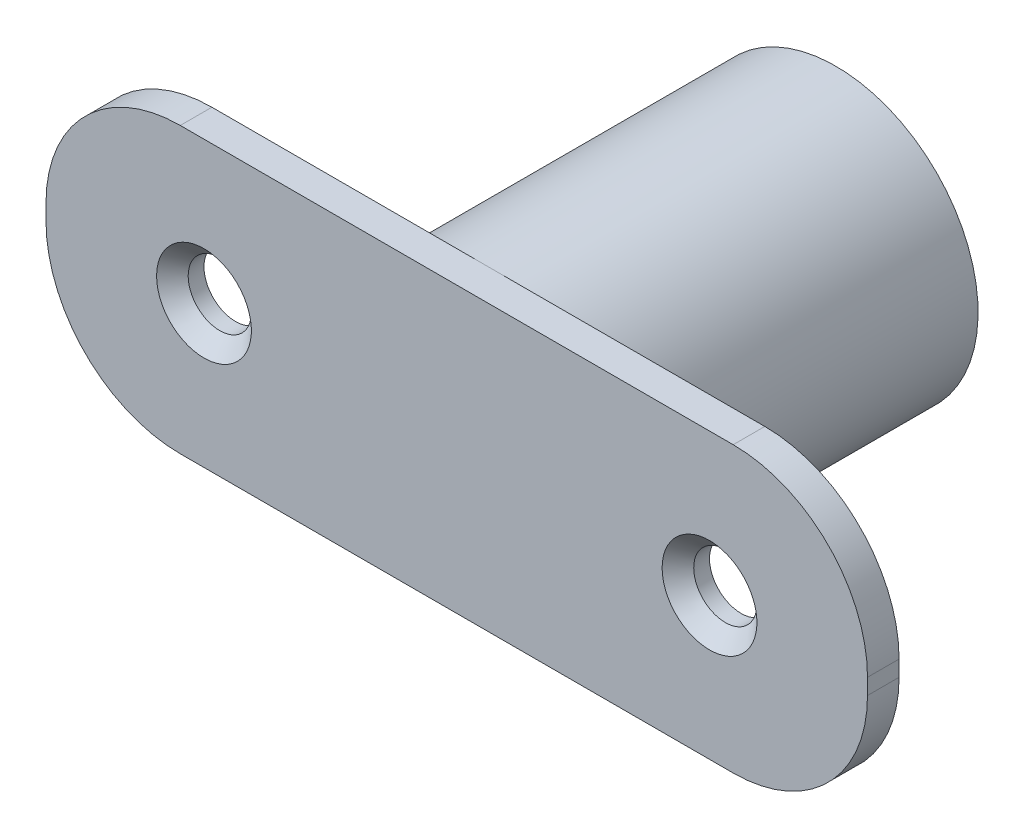
ISO-10303-21;
HEADER;
FILE_DESCRIPTION(('STEP AP214'),'2;1');
FILE_NAME('part.step','',(''),(''),'','','');
FILE_SCHEMA(('AUTOMOTIVE_DESIGN { 1 0 10303 214 1 1 1 1 }'));
ENDSEC;
DATA;
#1=APPLICATION_CONTEXT('core data for automotive mechanical design processes');
#2=APPLICATION_PROTOCOL_DEFINITION('international standard','automotive_design',2000,#1);
#3=PRODUCT_CONTEXT('',#1,'mechanical');
#4=PRODUCT('Part','Part','',(#3));
#5=PRODUCT_RELATED_PRODUCT_CATEGORY('part','',(#4));
#6=PRODUCT_DEFINITION_FORMATION('','',#4);
#7=PRODUCT_DEFINITION_CONTEXT('part definition',#1,'design');
#8=PRODUCT_DEFINITION('design','',#6,#7);
#9=PRODUCT_DEFINITION_SHAPE('','',#8);
#10=(LENGTH_UNIT() NAMED_UNIT(*) SI_UNIT(.MILLI.,.METRE.));
#11=(NAMED_UNIT(*) PLANE_ANGLE_UNIT() SI_UNIT($,.RADIAN.));
#12=(NAMED_UNIT(*) SI_UNIT($,.STERADIAN.) SOLID_ANGLE_UNIT());
#13=UNCERTAINTY_MEASURE_WITH_UNIT(LENGTH_MEASURE(1.E-05),#10,'distance_accuracy_value','');
#14=(GEOMETRIC_REPRESENTATION_CONTEXT(3) GLOBAL_UNCERTAINTY_ASSIGNED_CONTEXT((#13)) GLOBAL_UNIT_ASSIGNED_CONTEXT((#10,
#11,#12)) REPRESENTATION_CONTEXT('',''));
#15=CARTESIAN_POINT('',(0.,0.,0.));
#16=DIRECTION('',(0.,0.,1.));
#17=DIRECTION('',(1.,0.,0.));
#18=AXIS2_PLACEMENT_3D('',#15,#16,#17);
#19=CARTESIAN_POINT('',(43.5,-9.5,0.));
#20=DIRECTION('',(0.,0.,-1.));
#21=DIRECTION('',(-1.,0.,0.));
#22=AXIS2_PLACEMENT_3D('',#19,#20,#21);
#23=PLANE('',#22);
#24=CARTESIAN_POINT('',(26.,-9.,0.));
#25=DIRECTION('',(0.,0.,-1.));
#26=DIRECTION('',(-1.,0.,0.));
#27=AXIS2_PLACEMENT_3D('',#24,#25,#26);
#28=CIRCLE('',#27,9.);
#29=CARTESIAN_POINT('',(26.,0.,0.));
#30=VERTEX_POINT('',#29);
#31=CARTESIAN_POINT('',(26.,-18.,0.));
#32=VERTEX_POINT('',#31);
#33=EDGE_CURVE('E208',#30,#32,#28,.T.);
#34=ORIENTED_EDGE('',*,*,#33,.F.);
#35=DIRECTION('',(-1.,0.,0.));
#36=VECTOR('',#35,1.);
#37=CARTESIAN_POINT('',(8.50000000000006,0.,0.));
#38=LINE('',#37,#36);
#39=CARTESIAN_POINT('',(43.4999999999999,0.,0.));
#40=VERTEX_POINT('',#39);
#41=EDGE_CURVE('E152',#40,#30,#38,.T.);
#42=ORIENTED_EDGE('',*,*,#41,.F.);
#43=CARTESIAN_POINT('',(43.5,-8.5,0.));
#44=DIRECTION('',(0.,0.,1.));
#45=DIRECTION('',(-1.,0.,0.));
#46=AXIS2_PLACEMENT_3D('',#43,#44,#45);
#47=CIRCLE('',#46,8.5);
#48=CARTESIAN_POINT('',(52.,-8.50000000000006,0.));
#49=VERTEX_POINT('',#48);
#50=EDGE_CURVE('E149',#49,#40,#47,.T.);
#51=ORIENTED_EDGE('',*,*,#50,.F.);
#52=DIRECTION('',(0.,1.,0.));
#53=VECTOR('',#52,1.);
#54=CARTESIAN_POINT('',(52.,-8.50000000000006,0.));
#55=LINE('',#54,#53);
#56=CARTESIAN_POINT('',(52.,-9.49999999999994,0.));
#57=VERTEX_POINT('',#56);
#58=EDGE_CURVE('E146',#57,#49,#55,.T.);
#59=ORIENTED_EDGE('',*,*,#58,.F.);
#60=CARTESIAN_POINT('',(43.5,-9.5,0.));
#61=DIRECTION('',(0.,0.,1.));
#62=DIRECTION('',(-1.,0.,0.));
#63=AXIS2_PLACEMENT_3D('',#60,#61,#62);
#64=CIRCLE('',#63,8.5);
#65=CARTESIAN_POINT('',(43.4999999999999,-18.,0.));
#66=VERTEX_POINT('',#65);
#67=EDGE_CURVE('E143',#66,#57,#64,.T.);
#68=ORIENTED_EDGE('',*,*,#67,.F.);
#69=DIRECTION('',(1.,0.,0.));
#70=VECTOR('',#69,1.);
#71=CARTESIAN_POINT('',(8.50000000000006,-18.,0.));
#72=LINE('',#71,#70);
#73=EDGE_CURVE('E91',#32,#66,#72,.T.);
#74=ORIENTED_EDGE('',*,*,#73,.F.);
#75=EDGE_LOOP('',(#34,#42,#51,#59,#68,#74));
#76=FACE_BOUND('',#75,.T.);
#77=CARTESIAN_POINT('',(42.,-8.99999999999999,0.));
#78=DIRECTION('',(0.,0.,1.));
#79=DIRECTION('',(1.,0.,0.));
#80=AXIS2_PLACEMENT_3D('',#77,#78,#79);
#81=CIRCLE('',#80,2.);
#82=CARTESIAN_POINT('',(44.,-8.99999999999999,0.));
#83=VERTEX_POINT('',#82);
#84=EDGE_CURVE('E201',#83,#83,#81,.T.);
#85=ORIENTED_EDGE('',*,*,#84,.T.);
#86=EDGE_LOOP('',(#85));
#87=FACE_BOUND('',#86,.T.);
#88=ADVANCED_FACE('F35',(#76,#87),#23,.T.);
#89=CARTESIAN_POINT('',(43.5,-9.5,2.));
#90=DIRECTION('',(0.,0.,-1.));
#91=DIRECTION('',(-1.,0.,0.));
#92=AXIS2_PLACEMENT_3D('',#89,#90,#91);
#93=PLANE('',#92);
#94=CARTESIAN_POINT('',(42.,-8.99999999999999,2.));
#95=DIRECTION('',(0.,0.,-1.));
#96=DIRECTION('',(-1.,0.,0.));
#97=AXIS2_PLACEMENT_3D('',#94,#95,#96);
#98=CIRCLE('',#97,3.00000000000002);
#99=CARTESIAN_POINT('',(39.,-8.99999999999999,2.));
#100=VERTEX_POINT('',#99);
#101=EDGE_CURVE('E43',#100,#100,#98,.T.);
#102=ORIENTED_EDGE('',*,*,#101,.T.);
#103=EDGE_LOOP('',(#102));
#104=FACE_BOUND('',#103,.T.);
#105=CARTESIAN_POINT('',(10.,-9.,2.));
#106=DIRECTION('',(0.,0.,-1.));
#107=DIRECTION('',(-1.,0.,0.));
#108=AXIS2_PLACEMENT_3D('',#105,#106,#107);
#109=CIRCLE('',#108,3.00000000000002);
#110=CARTESIAN_POINT('',(6.99999999999999,-9.,2.));
#111=VERTEX_POINT('',#110);
#112=EDGE_CURVE('E180',#111,#111,#109,.T.);
#113=ORIENTED_EDGE('',*,*,#112,.T.);
#114=EDGE_LOOP('',(#113));
#115=FACE_BOUND('',#114,.T.);
#116=CARTESIAN_POINT('',(43.5,-9.5,2.));
#117=DIRECTION('',(0.,0.,1.));
#118=DIRECTION('',(-1.,0.,0.));
#119=AXIS2_PLACEMENT_3D('',#116,#117,#118);
#120=CIRCLE('',#119,8.5);
#121=CARTESIAN_POINT('',(43.4999999999999,-18.,2.));
#122=VERTEX_POINT('',#121);
#123=CARTESIAN_POINT('',(52.,-9.49999999999994,2.));
#124=VERTEX_POINT('',#123);
#125=EDGE_CURVE('E162',#122,#124,#120,.T.);
#126=ORIENTED_EDGE('',*,*,#125,.T.);
#127=DIRECTION('',(0.,1.,0.));
#128=VECTOR('',#127,1.);
#129=CARTESIAN_POINT('',(52.,-8.50000000000006,2.));
#130=LINE('',#129,#128);
#131=CARTESIAN_POINT('',(52.,-8.50000000000006,2.));
#132=VERTEX_POINT('',#131);
#133=EDGE_CURVE('E100',#124,#132,#130,.T.);
#134=ORIENTED_EDGE('',*,*,#133,.T.);
#135=CARTESIAN_POINT('',(43.5,-8.5,2.));
#136=DIRECTION('',(0.,0.,1.));
#137=DIRECTION('',(-1.,0.,0.));
#138=AXIS2_PLACEMENT_3D('',#135,#136,#137);
#139=CIRCLE('',#138,8.5);
#140=CARTESIAN_POINT('',(43.4999999999999,0.,2.));
#141=VERTEX_POINT('',#140);
#142=EDGE_CURVE('E214',#132,#141,#139,.T.);
#143=ORIENTED_EDGE('',*,*,#142,.T.);
#144=DIRECTION('',(-1.,0.,0.));
#145=VECTOR('',#144,1.);
#146=CARTESIAN_POINT('',(8.50000000000006,0.,2.));
#147=LINE('',#146,#145);
#148=CARTESIAN_POINT('',(8.50000000000006,0.,2.));
#149=VERTEX_POINT('',#148);
#150=EDGE_CURVE('E216',#141,#149,#147,.T.);
#151=ORIENTED_EDGE('',*,*,#150,.T.);
#152=CARTESIAN_POINT('',(8.5,-8.5,2.));
#153=DIRECTION('',(0.,0.,1.));
#154=DIRECTION('',(-1.,0.,0.));
#155=AXIS2_PLACEMENT_3D('',#152,#153,#154);
#156=CIRCLE('',#155,8.5);
#157=CARTESIAN_POINT('',(0.,-8.50000000000006,2.));
#158=VERTEX_POINT('',#157);
#159=EDGE_CURVE('E121',#149,#158,#156,.T.);
#160=ORIENTED_EDGE('',*,*,#159,.T.);
#161=DIRECTION('',(0.,-1.,0.));
#162=VECTOR('',#161,1.);
#163=CARTESIAN_POINT('',(0.,-8.50000000000006,2.));
#164=LINE('',#163,#162);
#165=CARTESIAN_POINT('',(0.,-9.49999999999994,2.));
#166=VERTEX_POINT('',#165);
#167=EDGE_CURVE('E114',#158,#166,#164,.T.);
#168=ORIENTED_EDGE('',*,*,#167,.T.);
#169=CARTESIAN_POINT('',(8.5,-9.5,2.));
#170=DIRECTION('',(0.,0.,1.));
#171=DIRECTION('',(1.,0.,0.));
#172=AXIS2_PLACEMENT_3D('',#169,#170,#171);
#173=CIRCLE('',#172,8.5);
#174=CARTESIAN_POINT('',(8.50000000000006,-18.,2.));
#175=VERTEX_POINT('',#174);
#176=EDGE_CURVE('E118',#166,#175,#173,.T.);
#177=ORIENTED_EDGE('',*,*,#176,.T.);
#178=DIRECTION('',(1.,0.,0.));
#179=VECTOR('',#178,1.);
#180=CARTESIAN_POINT('',(8.50000000000006,-18.,2.));
#181=LINE('',#180,#179);
#182=EDGE_CURVE('E59',#175,#122,#181,.T.);
#183=ORIENTED_EDGE('',*,*,#182,.T.);
#184=EDGE_LOOP('',(#126,#134,#143,#151,#160,#168,#177,#183));
#185=FACE_BOUND('',#184,.T.);
#186=ADVANCED_FACE('F116',(#104,#115,#185),#93,.F.);
#187=EDGE_CURVE('E50',#32,#30,#28,.T.);
#188=ORIENTED_EDGE('',*,*,#187,.F.);
#189=CARTESIAN_POINT('',(8.50000000000006,-18.,0.));
#190=VERTEX_POINT('',#189);
#191=EDGE_CURVE('E160',#190,#32,#72,.T.);
#192=ORIENTED_EDGE('',*,*,#191,.F.);
#193=CARTESIAN_POINT('',(8.5,-9.5,0.));
#194=DIRECTION('',(0.,0.,1.));
#195=DIRECTION('',(1.,0.,0.));
#196=AXIS2_PLACEMENT_3D('',#193,#194,#195);
#197=CIRCLE('',#196,8.5);
#198=CARTESIAN_POINT('',(0.,-9.49999999999994,0.));
#199=VERTEX_POINT('',#198);
#200=EDGE_CURVE('E158',#199,#190,#197,.T.);
#201=ORIENTED_EDGE('',*,*,#200,.F.);
#202=DIRECTION('',(0.,-1.,0.));
#203=VECTOR('',#202,1.);
#204=CARTESIAN_POINT('',(0.,-8.50000000000006,0.));
#205=LINE('',#204,#203);
#206=CARTESIAN_POINT('',(0.,-8.50000000000006,0.));
#207=VERTEX_POINT('',#206);
#208=EDGE_CURVE('E130',#207,#199,#205,.T.);
#209=ORIENTED_EDGE('',*,*,#208,.F.);
#210=CARTESIAN_POINT('',(8.5,-8.5,0.));
#211=DIRECTION('',(0.,0.,1.));
#212=DIRECTION('',(-1.,0.,0.));
#213=AXIS2_PLACEMENT_3D('',#210,#211,#212);
#214=CIRCLE('',#213,8.5);
#215=CARTESIAN_POINT('',(8.50000000000006,0.,0.));
#216=VERTEX_POINT('',#215);
#217=EDGE_CURVE('E155',#216,#207,#214,.T.);
#218=ORIENTED_EDGE('',*,*,#217,.F.);
#219=EDGE_CURVE('E151',#30,#216,#38,.T.);
#220=ORIENTED_EDGE('',*,*,#219,.F.);
#221=EDGE_LOOP('',(#188,#192,#201,#209,#218,#220));
#222=FACE_BOUND('',#221,.T.);
#223=CARTESIAN_POINT('',(10.,-9.,0.));
#224=DIRECTION('',(0.,0.,1.));
#225=DIRECTION('',(1.,0.,0.));
#226=AXIS2_PLACEMENT_3D('',#223,#224,#225);
#227=CIRCLE('',#226,2.);
#228=CARTESIAN_POINT('',(12.,-9.,0.));
#229=VERTEX_POINT('',#228);
#230=EDGE_CURVE('E147',#229,#229,#227,.T.);
#231=ORIENTED_EDGE('',*,*,#230,.T.);
#232=EDGE_LOOP('',(#231));
#233=FACE_BOUND('',#232,.T.);
#234=ADVANCED_FACE('F226',(#222,#233),#23,.T.);
#235=CARTESIAN_POINT('',(43.5,-9.5,2.));
#236=DIRECTION('',(0.,0.,-1.));
#237=DIRECTION('',(-1.,0.,0.));
#238=AXIS2_PLACEMENT_3D('',#235,#236,#237);
#239=CYLINDRICAL_SURFACE('',#238,8.5);
#240=ORIENTED_EDGE('',*,*,#67,.T.);
#241=DIRECTION('',(0.,0.,-1.));
#242=VECTOR('',#241,1.);
#243=CARTESIAN_POINT('',(52.,-9.49999999999994,2.));
#244=LINE('',#243,#242);
#245=EDGE_CURVE('E175',#124,#57,#244,.T.);
#246=ORIENTED_EDGE('',*,*,#245,.F.);
#247=ORIENTED_EDGE('',*,*,#125,.F.);
#248=DIRECTION('',(0.,0.,-1.));
#249=VECTOR('',#248,1.);
#250=CARTESIAN_POINT('',(43.4999999999999,-18.,2.));
#251=LINE('',#250,#249);
#252=EDGE_CURVE('E139',#122,#66,#251,.T.);
#253=ORIENTED_EDGE('',*,*,#252,.T.);
#254=EDGE_LOOP('',(#240,#246,#247,#253));
#255=FACE_BOUND('',#254,.T.);
#256=ADVANCED_FACE('F234',(#255),#239,.T.);
#257=CARTESIAN_POINT('',(52.,-8.50000000000006,2.));
#258=DIRECTION('',(-1.,0.,0.));
#259=DIRECTION('',(0.,0.,1.));
#260=AXIS2_PLACEMENT_3D('',#257,#258,#259);
#261=PLANE('',#260);
#262=ORIENTED_EDGE('',*,*,#58,.T.);
#263=DIRECTION('',(0.,0.,-1.));
#264=VECTOR('',#263,1.);
#265=CARTESIAN_POINT('',(52.,-8.50000000000006,2.));
#266=LINE('',#265,#264);
#267=EDGE_CURVE('E172',#132,#49,#266,.T.);
#268=ORIENTED_EDGE('',*,*,#267,.F.);
#269=ORIENTED_EDGE('',*,*,#133,.F.);
#270=ORIENTED_EDGE('',*,*,#245,.T.);
#271=EDGE_LOOP('',(#262,#268,#269,#270));
#272=FACE_BOUND('',#271,.T.);
#273=ADVANCED_FACE('F235',(#272),#261,.F.);
#274=CARTESIAN_POINT('',(43.5,-8.5,2.));
#275=DIRECTION('',(0.,0.,-1.));
#276=DIRECTION('',(-1.,0.,0.));
#277=AXIS2_PLACEMENT_3D('',#274,#275,#276);
#278=CYLINDRICAL_SURFACE('',#277,8.5);
#279=ORIENTED_EDGE('',*,*,#50,.T.);
#280=DIRECTION('',(0.,0.,-1.));
#281=VECTOR('',#280,1.);
#282=CARTESIAN_POINT('',(43.4999999999999,0.,2.));
#283=LINE('',#282,#281);
#284=EDGE_CURVE('E169',#141,#40,#283,.T.);
#285=ORIENTED_EDGE('',*,*,#284,.F.);
#286=ORIENTED_EDGE('',*,*,#142,.F.);
#287=ORIENTED_EDGE('',*,*,#267,.T.);
#288=EDGE_LOOP('',(#279,#285,#286,#287));
#289=FACE_BOUND('',#288,.T.);
#290=ADVANCED_FACE('F238',(#289),#278,.T.);
#291=CARTESIAN_POINT('',(8.50000000000006,0.,2.));
#292=DIRECTION('',(0.,-1.,0.));
#293=DIRECTION('',(1.,0.,0.));
#294=AXIS2_PLACEMENT_3D('',#291,#292,#293);
#295=PLANE('',#294);
#296=ORIENTED_EDGE('',*,*,#41,.T.);
#297=ORIENTED_EDGE('',*,*,#219,.T.);
#298=DIRECTION('',(0.,0.,-1.));
#299=VECTOR('',#298,1.);
#300=CARTESIAN_POINT('',(8.50000000000006,0.,2.));
#301=LINE('',#300,#299);
#302=EDGE_CURVE('E166',#149,#216,#301,.T.);
#303=ORIENTED_EDGE('',*,*,#302,.F.);
#304=ORIENTED_EDGE('',*,*,#150,.F.);
#305=ORIENTED_EDGE('',*,*,#284,.T.);
#306=EDGE_LOOP('',(#296,#297,#303,#304,#305));
#307=FACE_BOUND('',#306,.T.);
#308=ADVANCED_FACE('F222',(#307),#295,.F.);
#309=CARTESIAN_POINT('',(8.5,-8.5,2.));
#310=DIRECTION('',(0.,0.,-1.));
#311=DIRECTION('',(-1.,0.,0.));
#312=AXIS2_PLACEMENT_3D('',#309,#310,#311);
#313=CYLINDRICAL_SURFACE('',#312,8.5);
#314=ORIENTED_EDGE('',*,*,#217,.T.);
#315=DIRECTION('',(0.,0.,-1.));
#316=VECTOR('',#315,1.);
#317=CARTESIAN_POINT('',(0.,-8.50000000000006,2.));
#318=LINE('',#317,#316);
#319=EDGE_CURVE('E133',#158,#207,#318,.T.);
#320=ORIENTED_EDGE('',*,*,#319,.F.);
#321=ORIENTED_EDGE('',*,*,#159,.F.);
#322=ORIENTED_EDGE('',*,*,#302,.T.);
#323=EDGE_LOOP('',(#314,#320,#321,#322));
#324=FACE_BOUND('',#323,.T.);
#325=ADVANCED_FACE('F225',(#324),#313,.T.);
#326=CARTESIAN_POINT('',(0.,-8.50000000000006,2.));
#327=DIRECTION('',(1.,0.,0.));
#328=DIRECTION('',(0.,1.,0.));
#329=AXIS2_PLACEMENT_3D('',#326,#327,#328);
#330=PLANE('',#329);
#331=ORIENTED_EDGE('',*,*,#208,.T.);
#332=DIRECTION('',(0.,0.,-1.));
#333=VECTOR('',#332,1.);
#334=CARTESIAN_POINT('',(0.,-9.49999999999994,2.));
#335=LINE('',#334,#333);
#336=EDGE_CURVE('E127',#166,#199,#335,.T.);
#337=ORIENTED_EDGE('',*,*,#336,.F.);
#338=ORIENTED_EDGE('',*,*,#167,.F.);
#339=ORIENTED_EDGE('',*,*,#319,.T.);
#340=EDGE_LOOP('',(#331,#337,#338,#339));
#341=FACE_BOUND('',#340,.T.);
#342=ADVANCED_FACE('F128',(#341),#330,.F.);
#343=CARTESIAN_POINT('',(8.5,-9.5,2.));
#344=DIRECTION('',(0.,0.,-1.));
#345=DIRECTION('',(-1.,0.,0.));
#346=AXIS2_PLACEMENT_3D('',#343,#344,#345);
#347=CYLINDRICAL_SURFACE('',#346,8.5);
#348=ORIENTED_EDGE('',*,*,#200,.T.);
#349=DIRECTION('',(0.,0.,-1.));
#350=VECTOR('',#349,1.);
#351=CARTESIAN_POINT('',(8.50000000000006,-18.,2.));
#352=LINE('',#351,#350);
#353=EDGE_CURVE('E134',#175,#190,#352,.T.);
#354=ORIENTED_EDGE('',*,*,#353,.F.);
#355=ORIENTED_EDGE('',*,*,#176,.F.);
#356=ORIENTED_EDGE('',*,*,#336,.T.);
#357=EDGE_LOOP('',(#348,#354,#355,#356));
#358=FACE_BOUND('',#357,.T.);
#359=ADVANCED_FACE('F136',(#358),#347,.T.);
#360=CARTESIAN_POINT('',(8.50000000000006,-18.,2.));
#361=DIRECTION('',(0.,1.,0.));
#362=DIRECTION('',(0.,0.,1.));
#363=AXIS2_PLACEMENT_3D('',#360,#361,#362);
#364=PLANE('',#363);
#365=ORIENTED_EDGE('',*,*,#191,.T.);
#366=ORIENTED_EDGE('',*,*,#73,.T.);
#367=ORIENTED_EDGE('',*,*,#252,.F.);
#368=ORIENTED_EDGE('',*,*,#182,.F.);
#369=ORIENTED_EDGE('',*,*,#353,.T.);
#370=EDGE_LOOP('',(#365,#366,#367,#368,#369));
#371=FACE_BOUND('',#370,.T.);
#372=ADVANCED_FACE('F228',(#371),#364,.F.);
#373=CARTESIAN_POINT('',(10.,-9.,2.));
#374=DIRECTION('',(0.,0.,-1.));
#375=DIRECTION('',(-1.,0.,0.));
#376=AXIS2_PLACEMENT_3D('',#373,#374,#375);
#377=CYLINDRICAL_SURFACE('',#376,2.);
#378=CARTESIAN_POINT('',(10.,-9.,0.999999999999983));
#379=DIRECTION('',(0.,0.,-1.));
#380=DIRECTION('',(-1.,0.,0.));
#381=AXIS2_PLACEMENT_3D('',#378,#379,#380);
#382=CIRCLE('',#381,2.);
#383=CARTESIAN_POINT('',(8.,-9.,0.999999999999983));
#384=VERTEX_POINT('',#383);
#385=EDGE_CURVE('E11',#384,#384,#382,.F.);
#386=ORIENTED_EDGE('',*,*,#385,.T.);
#387=EDGE_LOOP('',(#386));
#388=FACE_BOUND('',#387,.T.);
#389=ORIENTED_EDGE('',*,*,#230,.F.);
#390=EDGE_LOOP('',(#389));
#391=FACE_BOUND('',#390,.T.);
#392=ADVANCED_FACE('F197',(#388,#391),#377,.F.);
#393=CARTESIAN_POINT('',(42.,-8.99999999999999,2.));
#394=DIRECTION('',(0.,0.,-1.));
#395=DIRECTION('',(-1.,0.,0.));
#396=AXIS2_PLACEMENT_3D('',#393,#394,#395);
#397=CYLINDRICAL_SURFACE('',#396,2.);
#398=CARTESIAN_POINT('',(42.,-8.99999999999999,0.999999999999986));
#399=DIRECTION('',(0.,0.,-1.));
#400=DIRECTION('',(-1.,0.,0.));
#401=AXIS2_PLACEMENT_3D('',#398,#399,#400);
#402=CIRCLE('',#401,2.);
#403=CARTESIAN_POINT('',(40.,-8.99999999999999,0.999999999999986));
#404=VERTEX_POINT('',#403);
#405=EDGE_CURVE('E177',#404,#404,#402,.F.);
#406=ORIENTED_EDGE('',*,*,#405,.T.);
#407=EDGE_LOOP('',(#406));
#408=FACE_BOUND('',#407,.T.);
#409=ORIENTED_EDGE('',*,*,#84,.F.);
#410=EDGE_LOOP('',(#409));
#411=FACE_BOUND('',#410,.T.);
#412=ADVANCED_FACE('F193',(#408,#411),#397,.F.);
#413=CARTESIAN_POINT('',(26.,-9.,-22.));
#414=DIRECTION('',(0.,0.,1.));
#415=DIRECTION('',(1.,0.,0.));
#416=AXIS2_PLACEMENT_3D('',#413,#414,#415);
#417=CYLINDRICAL_SURFACE('',#416,9.);
#418=CARTESIAN_POINT('',(26.,-9.,-22.));
#419=DIRECTION('',(0.,0.,-1.));
#420=DIRECTION('',(-1.,0.,0.));
#421=AXIS2_PLACEMENT_3D('',#418,#419,#420);
#422=CIRCLE('',#421,9.);
#423=CARTESIAN_POINT('',(17.,-9.,-22.));
#424=VERTEX_POINT('',#423);
#425=EDGE_CURVE('E203',#424,#424,#422,.T.);
#426=ORIENTED_EDGE('',*,*,#425,.F.);
#427=EDGE_LOOP('',(#426));
#428=FACE_BOUND('',#427,.T.);
#429=ORIENTED_EDGE('',*,*,#33,.T.);
#430=ORIENTED_EDGE('',*,*,#187,.T.);
#431=EDGE_LOOP('',(#429,#430));
#432=FACE_BOUND('',#431,.T.);
#433=ADVANCED_FACE('F196',(#428,#432),#417,.T.);
#434=CARTESIAN_POINT('',(0.,0.,-22.));
#435=DIRECTION('',(0.,0.,-1.));
#436=DIRECTION('',(-1.,0.,0.));
#437=AXIS2_PLACEMENT_3D('',#434,#435,#436);
#438=PLANE('',#437);
#439=ORIENTED_EDGE('',*,*,#425,.T.);
#440=EDGE_LOOP('',(#439));
#441=FACE_BOUND('',#440,.T.);
#442=ADVANCED_FACE('F190',(#441),#438,.T.);
#443=CARTESIAN_POINT('',(42.,-8.99999999999999,0.999999999999986));
#444=DIRECTION('',(0.,0.,1.));
#445=DIRECTION('',(1.,0.,0.));
#446=AXIS2_PLACEMENT_3D('',#443,#444,#445);
#447=CONICAL_SURFACE('',#446,2.,0.785398163397448);
#448=ORIENTED_EDGE('',*,*,#101,.F.);
#449=EDGE_LOOP('',(#448));
#450=FACE_BOUND('',#449,.T.);
#451=ORIENTED_EDGE('',*,*,#405,.F.);
#452=EDGE_LOOP('',(#451));
#453=FACE_BOUND('',#452,.T.);
#454=ADVANCED_FACE('F187',(#450,#453),#447,.F.);
#455=CARTESIAN_POINT('',(10.,-9.,0.999999999999983));
#456=DIRECTION('',(0.,0.,1.));
#457=DIRECTION('',(1.,0.,0.));
#458=AXIS2_PLACEMENT_3D('',#455,#456,#457);
#459=CONICAL_SURFACE('',#458,2.,0.785398163397448);
#460=ORIENTED_EDGE('',*,*,#112,.F.);
#461=EDGE_LOOP('',(#460));
#462=FACE_BOUND('',#461,.T.);
#463=ORIENTED_EDGE('',*,*,#385,.F.);
#464=EDGE_LOOP('',(#463));
#465=FACE_BOUND('',#464,.T.);
#466=ADVANCED_FACE('F37',(#462,#465),#459,.F.);
#467=CLOSED_SHELL('',(#88,#186,#234,#256,#273,#290,#308,#325,#342,#359,#372,#392,#412,#433,#442,
#454,#466));
#468=MANIFOLD_SOLID_BREP('B2',#467);
#469=ADVANCED_BREP_SHAPE_REPRESENTATION('',(#18,#468),#14);
#470=SHAPE_DEFINITION_REPRESENTATION(#9,#469);
ENDSEC;
END-ISO-10303-21;
